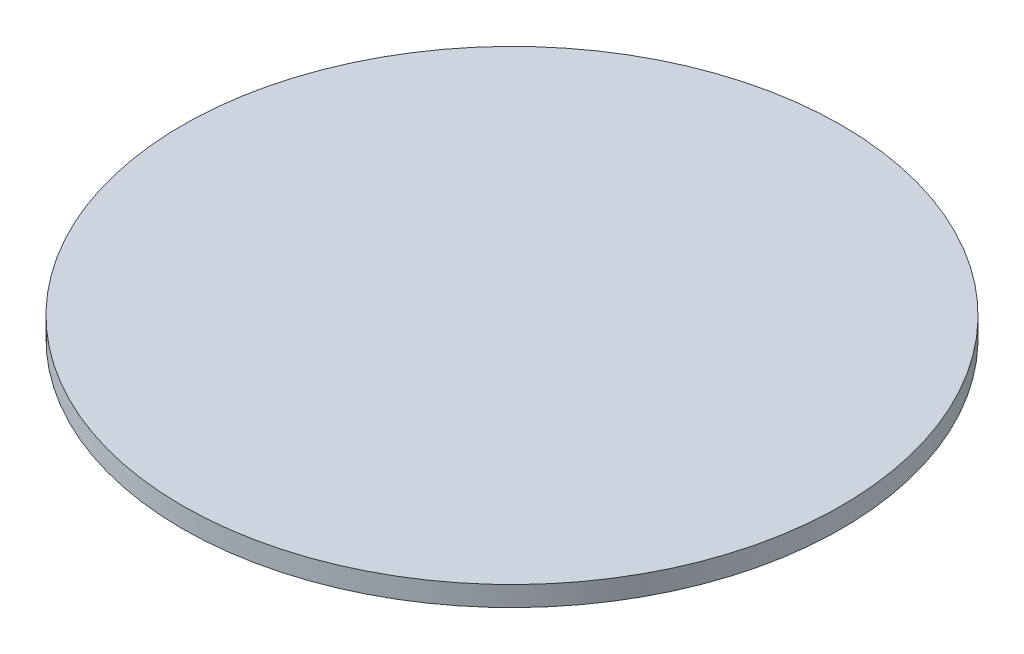
ISO-10303-21;
HEADER;
FILE_DESCRIPTION(('STEP AP214'),'2;1');
FILE_NAME('part.step','',(''),(''),'','','');
FILE_SCHEMA(('AUTOMOTIVE_DESIGN { 1 0 10303 214 1 1 1 1 }'));
ENDSEC;
DATA;
#1=APPLICATION_CONTEXT('core data for automotive mechanical design processes');
#2=APPLICATION_PROTOCOL_DEFINITION('international standard','automotive_design',2000,#1);
#3=PRODUCT_CONTEXT('',#1,'mechanical');
#4=PRODUCT('Part','Part','',(#3));
#5=PRODUCT_RELATED_PRODUCT_CATEGORY('part','',(#4));
#6=PRODUCT_DEFINITION_FORMATION('','',#4);
#7=PRODUCT_DEFINITION_CONTEXT('part definition',#1,'design');
#8=PRODUCT_DEFINITION('design','',#6,#7);
#9=PRODUCT_DEFINITION_SHAPE('','',#8);
#10=(LENGTH_UNIT() NAMED_UNIT(*) SI_UNIT(.MILLI.,.METRE.));
#11=(NAMED_UNIT(*) PLANE_ANGLE_UNIT() SI_UNIT($,.RADIAN.));
#12=(NAMED_UNIT(*) SI_UNIT($,.STERADIAN.) SOLID_ANGLE_UNIT());
#13=UNCERTAINTY_MEASURE_WITH_UNIT(LENGTH_MEASURE(1.E-05),#10,'distance_accuracy_value','');
#14=(GEOMETRIC_REPRESENTATION_CONTEXT(3) GLOBAL_UNCERTAINTY_ASSIGNED_CONTEXT((#13)) GLOBAL_UNIT_ASSIGNED_CONTEXT((#10,
#11,#12)) REPRESENTATION_CONTEXT('',''));
#15=CARTESIAN_POINT('',(0.,0.,0.));
#16=DIRECTION('',(0.,0.,1.));
#17=DIRECTION('',(1.,0.,0.));
#18=AXIS2_PLACEMENT_3D('',#15,#16,#17);
#19=CARTESIAN_POINT('',(0.,4.23333333333333,0.));
#20=DIRECTION('',(0.,-1.,0.));
#21=DIRECTION('',(0.,0.,-1.));
#22=AXIS2_PLACEMENT_3D('',#19,#20,#21);
#23=CYLINDRICAL_SURFACE('',#22,69.85);
#24=CARTESIAN_POINT('',(0.,4.23333333333333,0.));
#25=DIRECTION('',(0.,1.,0.));
#26=DIRECTION('',(0.,0.,1.));
#27=AXIS2_PLACEMENT_3D('',#24,#25,#26);
#28=CIRCLE('',#27,69.85);
#29=CARTESIAN_POINT('',(0.,4.23333333333333,69.85));
#30=VERTEX_POINT('',#29);
#31=EDGE_CURVE('E10',#30,#30,#28,.T.);
#32=ORIENTED_EDGE('',*,*,#31,.F.);
#33=EDGE_LOOP('',(#32));
#34=FACE_BOUND('',#33,.T.);
#35=CARTESIAN_POINT('',(0.,0.,0.));
#36=DIRECTION('',(0.,1.,0.));
#37=DIRECTION('',(0.,0.,1.));
#38=AXIS2_PLACEMENT_3D('',#35,#36,#37);
#39=CIRCLE('',#38,69.85);
#40=CARTESIAN_POINT('',(0.,0.,69.85));
#41=VERTEX_POINT('',#40);
#42=EDGE_CURVE('E44',#41,#41,#39,.T.);
#43=ORIENTED_EDGE('',*,*,#42,.T.);
#44=EDGE_LOOP('',(#43));
#45=FACE_BOUND('',#44,.T.);
#46=ADVANCED_FACE('F41',(#34,#45),#23,.T.);
#47=CARTESIAN_POINT('',(0.,4.23333333333333,0.));
#48=DIRECTION('',(0.,1.,0.));
#49=DIRECTION('',(0.,0.,1.));
#50=AXIS2_PLACEMENT_3D('',#47,#48,#49);
#51=PLANE('',#50);
#52=ORIENTED_EDGE('',*,*,#31,.T.);
#53=EDGE_LOOP('',(#52));
#54=FACE_BOUND('',#53,.T.);
#55=ADVANCED_FACE('F58',(#54),#51,.T.);
#56=CARTESIAN_POINT('',(0.,0.,0.));
#57=DIRECTION('',(0.,1.,0.));
#58=DIRECTION('',(0.,0.,1.));
#59=AXIS2_PLACEMENT_3D('',#56,#57,#58);
#60=PLANE('',#59);
#61=ORIENTED_EDGE('',*,*,#42,.F.);
#62=EDGE_LOOP('',(#61));
#63=FACE_BOUND('',#62,.T.);
#64=ADVANCED_FACE('F56',(#63),#60,.F.);
#65=CLOSED_SHELL('',(#46,#55,#64));
#66=MANIFOLD_SOLID_BREP('B2',#65);
#67=ADVANCED_BREP_SHAPE_REPRESENTATION('',(#18,#66),#14);
#68=SHAPE_DEFINITION_REPRESENTATION(#9,#67);
ENDSEC;
END-ISO-10303-21;
